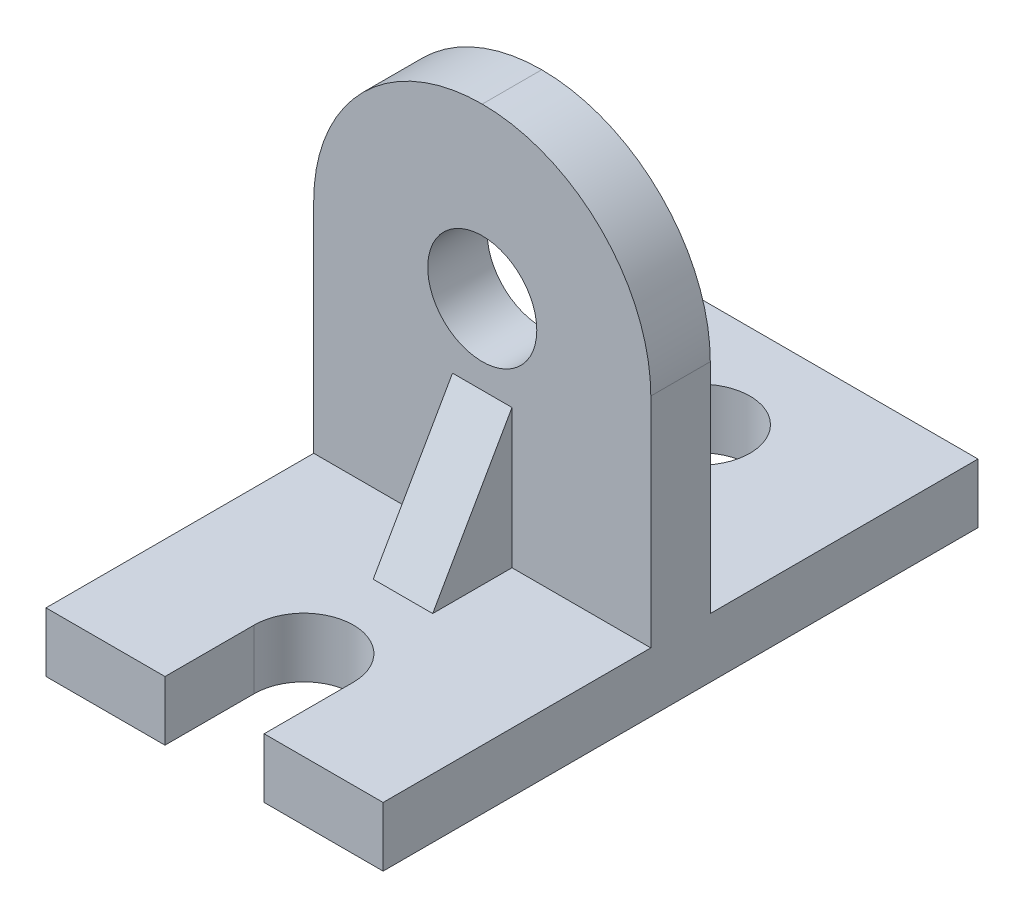
ISO-10303-21;
HEADER;
FILE_DESCRIPTION(('STEP AP214'),'2;1');
FILE_NAME('part.step','',(''),(''),'','','');
FILE_SCHEMA(('AUTOMOTIVE_DESIGN { 1 0 10303 214 1 1 1 1 }'));
ENDSEC;
DATA;
#1=APPLICATION_CONTEXT('core data for automotive mechanical design processes');
#2=APPLICATION_PROTOCOL_DEFINITION('international standard','automotive_design',2000,#1);
#3=PRODUCT_CONTEXT('',#1,'mechanical');
#4=PRODUCT('Part','Part','',(#3));
#5=PRODUCT_RELATED_PRODUCT_CATEGORY('part','',(#4));
#6=PRODUCT_DEFINITION_FORMATION('','',#4);
#7=PRODUCT_DEFINITION_CONTEXT('part definition',#1,'design');
#8=PRODUCT_DEFINITION('design','',#6,#7);
#9=PRODUCT_DEFINITION_SHAPE('','',#8);
#10=(LENGTH_UNIT() NAMED_UNIT(*) SI_UNIT(.MILLI.,.METRE.));
#11=(NAMED_UNIT(*) PLANE_ANGLE_UNIT() SI_UNIT($,.RADIAN.));
#12=(NAMED_UNIT(*) SI_UNIT($,.STERADIAN.) SOLID_ANGLE_UNIT());
#13=UNCERTAINTY_MEASURE_WITH_UNIT(LENGTH_MEASURE(1.E-05),#10,'distance_accuracy_value','');
#14=(GEOMETRIC_REPRESENTATION_CONTEXT(3) GLOBAL_UNCERTAINTY_ASSIGNED_CONTEXT((#13)) GLOBAL_UNIT_ASSIGNED_CONTEXT((#10,
#11,#12)) REPRESENTATION_CONTEXT('',''));
#15=CARTESIAN_POINT('',(0.,0.,0.));
#16=DIRECTION('',(0.,0.,1.));
#17=DIRECTION('',(1.,0.,0.));
#18=AXIS2_PLACEMENT_3D('',#15,#16,#17);
#19=CARTESIAN_POINT('',(-17.,0.,30.));
#20=DIRECTION('',(0.,0.,-1.));
#21=DIRECTION('',(-1.,0.,0.));
#22=AXIS2_PLACEMENT_3D('',#19,#20,#21);
#23=PLANE('',#22);
#24=DIRECTION('',(1.,0.,0.));
#25=VECTOR('',#24,1.);
#26=CARTESIAN_POINT('',(-17.,-19.5,30.));
#27=LINE('',#26,#25);
#28=CARTESIAN_POINT('',(5.,-19.5,30.));
#29=VERTEX_POINT('',#28);
#30=CARTESIAN_POINT('',(17.,-19.5,30.));
#31=VERTEX_POINT('',#30);
#32=EDGE_CURVE('E309',#29,#31,#27,.T.);
#33=ORIENTED_EDGE('',*,*,#32,.F.);
#34=DIRECTION('',(0.,1.,0.));
#35=VECTOR('',#34,1.);
#36=CARTESIAN_POINT('',(5.,-25.5,30.));
#37=LINE('',#36,#35);
#38=CARTESIAN_POINT('',(5.,-25.5,30.));
#39=VERTEX_POINT('',#38);
#40=EDGE_CURVE('E202',#39,#29,#37,.T.);
#41=ORIENTED_EDGE('',*,*,#40,.F.);
#42=DIRECTION('',(1.,0.,0.));
#43=VECTOR('',#42,1.);
#44=CARTESIAN_POINT('',(-17.,-25.5,30.));
#45=LINE('',#44,#43);
#46=CARTESIAN_POINT('',(17.,-25.5,30.));
#47=VERTEX_POINT('',#46);
#48=EDGE_CURVE('E194',#39,#47,#45,.T.);
#49=ORIENTED_EDGE('',*,*,#48,.T.);
#50=DIRECTION('',(0.,1.,0.));
#51=VECTOR('',#50,1.);
#52=CARTESIAN_POINT('',(17.,0.,30.));
#53=LINE('',#52,#51);
#54=EDGE_CURVE('E264',#47,#31,#53,.T.);
#55=ORIENTED_EDGE('',*,*,#54,.T.);
#56=EDGE_LOOP('',(#33,#41,#49,#55));
#57=FACE_BOUND('',#56,.T.);
#58=ADVANCED_FACE('F37',(#57),#23,.F.);
#59=CARTESIAN_POINT('',(-17.,0.,3.));
#60=DIRECTION('',(0.,0.,-1.));
#61=DIRECTION('',(-1.,0.,0.));
#62=AXIS2_PLACEMENT_3D('',#59,#60,#61);
#63=PLANE('',#62);
#64=CARTESIAN_POINT('',(0.,2.5,3.));
#65=DIRECTION('',(0.,0.,1.));
#66=DIRECTION('',(1.,0.,0.));
#67=AXIS2_PLACEMENT_3D('',#64,#65,#66);
#68=CIRCLE('',#67,5.5);
#69=CARTESIAN_POINT('',(5.5,2.5,3.));
#70=VERTEX_POINT('',#69);
#71=EDGE_CURVE('E252',#70,#70,#68,.T.);
#72=ORIENTED_EDGE('',*,*,#71,.F.);
#73=EDGE_LOOP('',(#72));
#74=FACE_BOUND('',#73,.T.);
#75=DIRECTION('',(0.,1.,0.));
#76=VECTOR('',#75,1.);
#77=CARTESIAN_POINT('',(-3.,0.,3.));
#78=LINE('',#77,#76);
#79=CARTESIAN_POINT('',(-3.,-19.5,3.));
#80=VERTEX_POINT('',#79);
#81=CARTESIAN_POINT('',(-3.,-5.5,3.));
#82=VERTEX_POINT('',#81);
#83=EDGE_CURVE('E245',#80,#82,#78,.T.);
#84=ORIENTED_EDGE('',*,*,#83,.T.);
#85=DIRECTION('',(1.,0.,0.));
#86=VECTOR('',#85,1.);
#87=CARTESIAN_POINT('',(-3.,-5.5,3.));
#88=LINE('',#87,#86);
#89=CARTESIAN_POINT('',(3.,-5.5,3.));
#90=VERTEX_POINT('',#89);
#91=EDGE_CURVE('E249',#82,#90,#88,.T.);
#92=ORIENTED_EDGE('',*,*,#91,.T.);
#93=DIRECTION('',(0.,1.,0.));
#94=VECTOR('',#93,1.);
#95=CARTESIAN_POINT('',(3.,0.,3.));
#96=LINE('',#95,#94);
#97=CARTESIAN_POINT('',(3.,-19.5,3.));
#98=VERTEX_POINT('',#97);
#99=EDGE_CURVE('E238',#98,#90,#96,.T.);
#100=ORIENTED_EDGE('',*,*,#99,.F.);
#101=DIRECTION('',(1.,0.,0.));
#102=VECTOR('',#101,1.);
#103=CARTESIAN_POINT('',(-17.,-19.5,3.));
#104=LINE('',#103,#102);
#105=CARTESIAN_POINT('',(17.,-19.5,3.));
#106=VERTEX_POINT('',#105);
#107=EDGE_CURVE('E294',#98,#106,#104,.T.);
#108=ORIENTED_EDGE('',*,*,#107,.T.);
#109=DIRECTION('',(0.,1.,0.));
#110=VECTOR('',#109,1.);
#111=CARTESIAN_POINT('',(17.,0.,3.));
#112=LINE('',#111,#110);
#113=CARTESIAN_POINT('',(17.,2.5,3.));
#114=VERTEX_POINT('',#113);
#115=EDGE_CURVE('E257',#106,#114,#112,.T.);
#116=ORIENTED_EDGE('',*,*,#115,.T.);
#117=CARTESIAN_POINT('',(0.,2.5,3.));
#118=DIRECTION('',(0.,0.,-1.));
#119=DIRECTION('',(-1.,0.,0.));
#120=AXIS2_PLACEMENT_3D('',#117,#118,#119);
#121=CIRCLE('',#120,17.);
#122=CARTESIAN_POINT('',(0.,19.5,3.));
#123=VERTEX_POINT('',#122);
#124=EDGE_CURVE('E319',#114,#123,#121,.F.);
#125=ORIENTED_EDGE('',*,*,#124,.T.);
#126=CARTESIAN_POINT('',(0.,2.5,3.));
#127=DIRECTION('',(0.,0.,-1.));
#128=DIRECTION('',(-1.,0.,0.));
#129=AXIS2_PLACEMENT_3D('',#126,#127,#128);
#130=CIRCLE('',#129,17.);
#131=CARTESIAN_POINT('',(-17.,2.5,3.));
#132=VERTEX_POINT('',#131);
#133=EDGE_CURVE('E46',#123,#132,#130,.F.);
#134=ORIENTED_EDGE('',*,*,#133,.T.);
#135=DIRECTION('',(0.,1.,0.));
#136=VECTOR('',#135,1.);
#137=CARTESIAN_POINT('',(-17.,0.,3.));
#138=LINE('',#137,#136);
#139=CARTESIAN_POINT('',(-17.,-19.5,3.));
#140=VERTEX_POINT('',#139);
#141=EDGE_CURVE('E277',#140,#132,#138,.T.);
#142=ORIENTED_EDGE('',*,*,#141,.F.);
#143=EDGE_CURVE('E310',#140,#80,#104,.T.);
#144=ORIENTED_EDGE('',*,*,#143,.T.);
#145=EDGE_LOOP('',(#84,#92,#100,#108,#116,#125,#134,#142,#144));
#146=FACE_BOUND('',#145,.T.);
#147=ADVANCED_FACE('F343',(#74,#146),#63,.F.);
#148=CARTESIAN_POINT('',(-17.,-19.5,0.));
#149=DIRECTION('',(0.,-1.,0.));
#150=DIRECTION('',(0.,0.,-1.));
#151=AXIS2_PLACEMENT_3D('',#148,#149,#150);
#152=PLANE('',#151);
#153=CARTESIAN_POINT('',(0.,-19.5,21.));
#154=DIRECTION('',(0.,1.,0.));
#155=DIRECTION('',(0.,0.,1.));
#156=AXIS2_PLACEMENT_3D('',#153,#154,#155);
#157=CIRCLE('',#156,5.);
#158=CARTESIAN_POINT('',(5.,-19.5,21.));
#159=VERTEX_POINT('',#158);
#160=CARTESIAN_POINT('',(-5.,-19.5,21.));
#161=VERTEX_POINT('',#160);
#162=EDGE_CURVE('E196',#159,#161,#157,.T.);
#163=ORIENTED_EDGE('',*,*,#162,.F.);
#164=DIRECTION('',(0.,0.,-1.));
#165=VECTOR('',#164,1.);
#166=CARTESIAN_POINT('',(5.,-19.5,0.));
#167=LINE('',#166,#165);
#168=EDGE_CURVE('E176',#29,#159,#167,.T.);
#169=ORIENTED_EDGE('',*,*,#168,.F.);
#170=ORIENTED_EDGE('',*,*,#32,.T.);
#171=DIRECTION('',(0.,0.,-1.));
#172=VECTOR('',#171,1.);
#173=CARTESIAN_POINT('',(17.,-19.5,0.));
#174=LINE('',#173,#172);
#175=EDGE_CURVE('E260',#31,#106,#174,.T.);
#176=ORIENTED_EDGE('',*,*,#175,.T.);
#177=ORIENTED_EDGE('',*,*,#107,.F.);
#178=DIRECTION('',(0.,0.,-1.));
#179=VECTOR('',#178,1.);
#180=CARTESIAN_POINT('',(3.,-19.5,0.));
#181=LINE('',#180,#179);
#182=CARTESIAN_POINT('',(3.,-19.5,11.));
#183=VERTEX_POINT('',#182);
#184=EDGE_CURVE('E236',#183,#98,#181,.T.);
#185=ORIENTED_EDGE('',*,*,#184,.F.);
#186=DIRECTION('',(1.,0.,0.));
#187=VECTOR('',#186,1.);
#188=CARTESIAN_POINT('',(-3.,-19.5,11.));
#189=LINE('',#188,#187);
#190=CARTESIAN_POINT('',(-3.,-19.5,11.));
#191=VERTEX_POINT('',#190);
#192=EDGE_CURVE('E248',#191,#183,#189,.T.);
#193=ORIENTED_EDGE('',*,*,#192,.F.);
#194=DIRECTION('',(0.,0.,-1.));
#195=VECTOR('',#194,1.);
#196=CARTESIAN_POINT('',(-3.,-19.5,0.));
#197=LINE('',#196,#195);
#198=EDGE_CURVE('E242',#191,#80,#197,.T.);
#199=ORIENTED_EDGE('',*,*,#198,.T.);
#200=ORIENTED_EDGE('',*,*,#143,.F.);
#201=DIRECTION('',(0.,0.,-1.));
#202=VECTOR('',#201,1.);
#203=CARTESIAN_POINT('',(-17.,-19.5,0.));
#204=LINE('',#203,#202);
#205=CARTESIAN_POINT('',(-17.,-19.5,30.));
#206=VERTEX_POINT('',#205);
#207=EDGE_CURVE('E280',#206,#140,#204,.T.);
#208=ORIENTED_EDGE('',*,*,#207,.F.);
#209=CARTESIAN_POINT('',(-5.,-19.5,30.));
#210=VERTEX_POINT('',#209);
#211=EDGE_CURVE('E306',#206,#210,#27,.T.);
#212=ORIENTED_EDGE('',*,*,#211,.T.);
#213=DIRECTION('',(0.,0.,1.));
#214=VECTOR('',#213,1.);
#215=CARTESIAN_POINT('',(-5.,-19.5,0.));
#216=LINE('',#215,#214);
#217=EDGE_CURVE('E54',#161,#210,#216,.T.);
#218=ORIENTED_EDGE('',*,*,#217,.F.);
#219=EDGE_LOOP('',(#163,#169,#170,#176,#177,#185,#193,#199,#200,#208,#212,#218));
#220=FACE_BOUND('',#219,.T.);
#221=ADVANCED_FACE('F334',(#220),#152,.F.);
#222=CARTESIAN_POINT('',(-17.,0.,-3.));
#223=DIRECTION('',(0.,0.,-1.));
#224=DIRECTION('',(-1.,0.,0.));
#225=AXIS2_PLACEMENT_3D('',#222,#223,#224);
#226=PLANE('',#225);
#227=DIRECTION('',(0.,1.,0.));
#228=VECTOR('',#227,1.);
#229=CARTESIAN_POINT('',(3.,0.,-3.));
#230=LINE('',#229,#228);
#231=CARTESIAN_POINT('',(3.,-19.5,-3.));
#232=VERTEX_POINT('',#231);
#233=CARTESIAN_POINT('',(3.,-5.5,-3.));
#234=VERTEX_POINT('',#233);
#235=EDGE_CURVE('E62',#232,#234,#230,.T.);
#236=ORIENTED_EDGE('',*,*,#235,.T.);
#237=DIRECTION('',(-1.,0.,0.));
#238=VECTOR('',#237,1.);
#239=CARTESIAN_POINT('',(3.,-5.5,-3.));
#240=LINE('',#239,#238);
#241=CARTESIAN_POINT('',(-3.,-5.5,-3.));
#242=VERTEX_POINT('',#241);
#243=EDGE_CURVE('E231',#234,#242,#240,.T.);
#244=ORIENTED_EDGE('',*,*,#243,.T.);
#245=DIRECTION('',(0.,1.,0.));
#246=VECTOR('',#245,1.);
#247=CARTESIAN_POINT('',(-3.,0.,-3.));
#248=LINE('',#247,#246);
#249=CARTESIAN_POINT('',(-3.,-19.5,-3.));
#250=VERTEX_POINT('',#249);
#251=EDGE_CURVE('E216',#250,#242,#248,.T.);
#252=ORIENTED_EDGE('',*,*,#251,.F.);
#253=DIRECTION('',(1.,0.,0.));
#254=VECTOR('',#253,1.);
#255=CARTESIAN_POINT('',(-17.,-19.5,-3.));
#256=LINE('',#255,#254);
#257=CARTESIAN_POINT('',(-17.,-19.5,-3.));
#258=VERTEX_POINT('',#257);
#259=EDGE_CURVE('E295',#258,#250,#256,.T.);
#260=ORIENTED_EDGE('',*,*,#259,.F.);
#261=DIRECTION('',(0.,1.,0.));
#262=VECTOR('',#261,1.);
#263=CARTESIAN_POINT('',(-17.,0.,-3.));
#264=LINE('',#263,#262);
#265=CARTESIAN_POINT('',(-17.,2.5,-3.));
#266=VERTEX_POINT('',#265);
#267=EDGE_CURVE('E291',#258,#266,#264,.T.);
#268=ORIENTED_EDGE('',*,*,#267,.T.);
#269=CARTESIAN_POINT('',(0.,2.5,-3.));
#270=DIRECTION('',(0.,0.,-1.));
#271=DIRECTION('',(-1.,0.,0.));
#272=AXIS2_PLACEMENT_3D('',#269,#270,#271);
#273=CIRCLE('',#272,17.);
#274=CARTESIAN_POINT('',(0.,19.5,-3.));
#275=VERTEX_POINT('',#274);
#276=EDGE_CURVE('E317',#266,#275,#273,.T.);
#277=ORIENTED_EDGE('',*,*,#276,.T.);
#278=CARTESIAN_POINT('',(0.,2.5,-3.));
#279=DIRECTION('',(0.,0.,-1.));
#280=DIRECTION('',(-1.,0.,0.));
#281=AXIS2_PLACEMENT_3D('',#278,#279,#280);
#282=CIRCLE('',#281,17.);
#283=CARTESIAN_POINT('',(17.,2.5,-3.));
#284=VERTEX_POINT('',#283);
#285=EDGE_CURVE('E315',#275,#284,#282,.T.);
#286=ORIENTED_EDGE('',*,*,#285,.T.);
#287=DIRECTION('',(0.,1.,0.));
#288=VECTOR('',#287,1.);
#289=CARTESIAN_POINT('',(17.,0.,-3.));
#290=LINE('',#289,#288);
#291=CARTESIAN_POINT('',(17.,-19.5,-3.));
#292=VERTEX_POINT('',#291);
#293=EDGE_CURVE('E274',#292,#284,#290,.T.);
#294=ORIENTED_EDGE('',*,*,#293,.F.);
#295=EDGE_CURVE('E298',#232,#292,#256,.T.);
#296=ORIENTED_EDGE('',*,*,#295,.F.);
#297=EDGE_LOOP('',(#236,#244,#252,#260,#268,#277,#286,#294,#296));
#298=FACE_BOUND('',#297,.T.);
#299=CARTESIAN_POINT('',(0.,2.5,-3.));
#300=DIRECTION('',(0.,0.,-1.));
#301=DIRECTION('',(-1.,0.,0.));
#302=AXIS2_PLACEMENT_3D('',#299,#300,#301);
#303=CIRCLE('',#302,5.5);
#304=CARTESIAN_POINT('',(-5.5,2.5,-3.));
#305=VERTEX_POINT('',#304);
#306=EDGE_CURVE('E41',#305,#305,#303,.T.);
#307=ORIENTED_EDGE('',*,*,#306,.F.);
#308=EDGE_LOOP('',(#307));
#309=FACE_BOUND('',#308,.T.);
#310=ADVANCED_FACE('F331',(#298,#309),#226,.T.);
#311=CARTESIAN_POINT('',(0.,-19.5,-19.));
#312=DIRECTION('',(0.,1.,0.));
#313=DIRECTION('',(0.,0.,1.));
#314=AXIS2_PLACEMENT_3D('',#311,#312,#313);
#315=CIRCLE('',#314,5.);
#316=CARTESIAN_POINT('',(0.,-19.5,-14.));
#317=VERTEX_POINT('',#316);
#318=EDGE_CURVE('E204',#317,#317,#315,.T.);
#319=ORIENTED_EDGE('',*,*,#318,.F.);
#320=EDGE_LOOP('',(#319));
#321=FACE_BOUND('',#320,.T.);
#322=DIRECTION('',(-1.,0.,0.));
#323=VECTOR('',#322,1.);
#324=CARTESIAN_POINT('',(3.,-19.5,-11.));
#325=LINE('',#324,#323);
#326=CARTESIAN_POINT('',(3.,-19.5,-11.));
#327=VERTEX_POINT('',#326);
#328=CARTESIAN_POINT('',(-3.,-19.5,-11.));
#329=VERTEX_POINT('',#328);
#330=EDGE_CURVE('E228',#327,#329,#325,.T.);
#331=ORIENTED_EDGE('',*,*,#330,.F.);
#332=DIRECTION('',(0.,0.,-1.));
#333=VECTOR('',#332,1.);
#334=CARTESIAN_POINT('',(3.,-19.5,0.));
#335=LINE('',#334,#333);
#336=EDGE_CURVE('E225',#232,#327,#335,.T.);
#337=ORIENTED_EDGE('',*,*,#336,.F.);
#338=ORIENTED_EDGE('',*,*,#295,.T.);
#339=CARTESIAN_POINT('',(17.,-19.5,-30.));
#340=VERTEX_POINT('',#339);
#341=EDGE_CURVE('E265',#292,#340,#174,.T.);
#342=ORIENTED_EDGE('',*,*,#341,.T.);
#343=DIRECTION('',(1.,0.,0.));
#344=VECTOR('',#343,1.);
#345=CARTESIAN_POINT('',(-17.,-19.5,-30.));
#346=LINE('',#345,#344);
#347=CARTESIAN_POINT('',(-17.,-19.5,-30.));
#348=VERTEX_POINT('',#347);
#349=EDGE_CURVE('E299',#348,#340,#346,.T.);
#350=ORIENTED_EDGE('',*,*,#349,.F.);
#351=EDGE_CURVE('E283',#258,#348,#204,.T.);
#352=ORIENTED_EDGE('',*,*,#351,.F.);
#353=ORIENTED_EDGE('',*,*,#259,.T.);
#354=DIRECTION('',(0.,0.,-1.));
#355=VECTOR('',#354,1.);
#356=CARTESIAN_POINT('',(-3.,-19.5,0.));
#357=LINE('',#356,#355);
#358=EDGE_CURVE('E219',#250,#329,#357,.T.);
#359=ORIENTED_EDGE('',*,*,#358,.T.);
#360=EDGE_LOOP('',(#331,#337,#338,#342,#350,#352,#353,#359));
#361=FACE_BOUND('',#360,.T.);
#362=ADVANCED_FACE('F333',(#321,#361),#152,.F.);
#363=CARTESIAN_POINT('',(-17.,0.,-30.));
#364=DIRECTION('',(0.,0.,-1.));
#365=DIRECTION('',(-1.,0.,0.));
#366=AXIS2_PLACEMENT_3D('',#363,#364,#365);
#367=PLANE('',#366);
#368=ORIENTED_EDGE('',*,*,#349,.T.);
#369=DIRECTION('',(0.,1.,0.));
#370=VECTOR('',#369,1.);
#371=CARTESIAN_POINT('',(17.,0.,-30.));
#372=LINE('',#371,#370);
#373=CARTESIAN_POINT('',(17.,-25.5,-30.));
#374=VERTEX_POINT('',#373);
#375=EDGE_CURVE('E271',#374,#340,#372,.T.);
#376=ORIENTED_EDGE('',*,*,#375,.F.);
#377=DIRECTION('',(1.,0.,0.));
#378=VECTOR('',#377,1.);
#379=CARTESIAN_POINT('',(-17.,-25.5,-30.));
#380=LINE('',#379,#378);
#381=CARTESIAN_POINT('',(-17.,-25.5,-30.));
#382=VERTEX_POINT('',#381);
#383=EDGE_CURVE('E301',#382,#374,#380,.T.);
#384=ORIENTED_EDGE('',*,*,#383,.F.);
#385=DIRECTION('',(0.,1.,0.));
#386=VECTOR('',#385,1.);
#387=CARTESIAN_POINT('',(-17.,0.,-30.));
#388=LINE('',#387,#386);
#389=EDGE_CURVE('E288',#382,#348,#388,.T.);
#390=ORIENTED_EDGE('',*,*,#389,.T.);
#391=EDGE_LOOP('',(#368,#376,#384,#390));
#392=FACE_BOUND('',#391,.T.);
#393=ADVANCED_FACE('F340',(#392),#367,.T.);
#394=CARTESIAN_POINT('',(-17.,-25.5,0.));
#395=DIRECTION('',(0.,-1.,0.));
#396=DIRECTION('',(0.,0.,-1.));
#397=AXIS2_PLACEMENT_3D('',#394,#395,#396);
#398=PLANE('',#397);
#399=DIRECTION('',(0.,0.,-1.));
#400=VECTOR('',#399,1.);
#401=CARTESIAN_POINT('',(5.,-25.5,0.));
#402=LINE('',#401,#400);
#403=CARTESIAN_POINT('',(5.,-25.5,21.));
#404=VERTEX_POINT('',#403);
#405=EDGE_CURVE('E173',#39,#404,#402,.T.);
#406=ORIENTED_EDGE('',*,*,#405,.T.);
#407=CARTESIAN_POINT('',(0.,-25.5,21.));
#408=DIRECTION('',(0.,1.,0.));
#409=DIRECTION('',(0.,0.,1.));
#410=AXIS2_PLACEMENT_3D('',#407,#408,#409);
#411=CIRCLE('',#410,5.);
#412=CARTESIAN_POINT('',(-5.,-25.5,21.));
#413=VERTEX_POINT('',#412);
#414=EDGE_CURVE('E184',#404,#413,#411,.T.);
#415=ORIENTED_EDGE('',*,*,#414,.T.);
#416=DIRECTION('',(0.,0.,1.));
#417=VECTOR('',#416,1.);
#418=CARTESIAN_POINT('',(-5.,-25.5,0.));
#419=LINE('',#418,#417);
#420=CARTESIAN_POINT('',(-5.,-25.5,30.));
#421=VERTEX_POINT('',#420);
#422=EDGE_CURVE('E181',#413,#421,#419,.T.);
#423=ORIENTED_EDGE('',*,*,#422,.T.);
#424=CARTESIAN_POINT('',(-17.,-25.5,30.));
#425=VERTEX_POINT('',#424);
#426=EDGE_CURVE('E303',#425,#421,#45,.T.);
#427=ORIENTED_EDGE('',*,*,#426,.F.);
#428=DIRECTION('',(0.,0.,-1.));
#429=VECTOR('',#428,1.);
#430=CARTESIAN_POINT('',(-17.,-25.5,0.));
#431=LINE('',#430,#429);
#432=EDGE_CURVE('E285',#425,#382,#431,.T.);
#433=ORIENTED_EDGE('',*,*,#432,.T.);
#434=ORIENTED_EDGE('',*,*,#383,.T.);
#435=DIRECTION('',(0.,0.,-1.));
#436=VECTOR('',#435,1.);
#437=CARTESIAN_POINT('',(17.,-25.5,0.));
#438=LINE('',#437,#436);
#439=EDGE_CURVE('E268',#47,#374,#438,.T.);
#440=ORIENTED_EDGE('',*,*,#439,.F.);
#441=ORIENTED_EDGE('',*,*,#48,.F.);
#442=EDGE_LOOP('',(#406,#415,#423,#427,#433,#434,#440,#441));
#443=FACE_BOUND('',#442,.T.);
#444=CARTESIAN_POINT('',(0.,-25.5,-19.));
#445=DIRECTION('',(0.,1.,0.));
#446=DIRECTION('',(0.,0.,1.));
#447=AXIS2_PLACEMENT_3D('',#444,#445,#446);
#448=CIRCLE('',#447,5.);
#449=CARTESIAN_POINT('',(0.,-25.5,-14.));
#450=VERTEX_POINT('',#449);
#451=EDGE_CURVE('E208',#450,#450,#448,.T.);
#452=ORIENTED_EDGE('',*,*,#451,.T.);
#453=EDGE_LOOP('',(#452));
#454=FACE_BOUND('',#453,.T.);
#455=ADVANCED_FACE('F191',(#443,#454),#398,.T.);
#456=ORIENTED_EDGE('',*,*,#426,.T.);
#457=DIRECTION('',(0.,1.,0.));
#458=VECTOR('',#457,1.);
#459=CARTESIAN_POINT('',(-5.,-25.5,30.));
#460=LINE('',#459,#458);
#461=EDGE_CURVE('E205',#421,#210,#460,.T.);
#462=ORIENTED_EDGE('',*,*,#461,.T.);
#463=ORIENTED_EDGE('',*,*,#211,.F.);
#464=DIRECTION('',(0.,1.,0.));
#465=VECTOR('',#464,1.);
#466=CARTESIAN_POINT('',(-17.,0.,30.));
#467=LINE('',#466,#465);
#468=EDGE_CURVE('E282',#425,#206,#467,.T.);
#469=ORIENTED_EDGE('',*,*,#468,.F.);
#470=EDGE_LOOP('',(#456,#462,#463,#469));
#471=FACE_BOUND('',#470,.T.);
#472=ADVANCED_FACE('F349',(#471),#23,.F.);
#473=CARTESIAN_POINT('',(-17.,0.,0.));
#474=DIRECTION('',(1.,0.,0.));
#475=DIRECTION('',(0.,0.,-1.));
#476=AXIS2_PLACEMENT_3D('',#473,#474,#475);
#477=PLANE('',#476);
#478=ORIENTED_EDGE('',*,*,#141,.T.);
#479=DIRECTION('',(0.,0.,-1.));
#480=VECTOR('',#479,1.);
#481=CARTESIAN_POINT('',(-17.,2.5,0.));
#482=LINE('',#481,#480);
#483=EDGE_CURVE('E297',#132,#266,#482,.T.);
#484=ORIENTED_EDGE('',*,*,#483,.T.);
#485=ORIENTED_EDGE('',*,*,#267,.F.);
#486=ORIENTED_EDGE('',*,*,#351,.T.);
#487=ORIENTED_EDGE('',*,*,#389,.F.);
#488=ORIENTED_EDGE('',*,*,#432,.F.);
#489=ORIENTED_EDGE('',*,*,#468,.T.);
#490=ORIENTED_EDGE('',*,*,#207,.T.);
#491=EDGE_LOOP('',(#478,#484,#485,#486,#487,#488,#489,#490));
#492=FACE_BOUND('',#491,.T.);
#493=ADVANCED_FACE('F358',(#492),#477,.F.);
#494=CARTESIAN_POINT('',(17.,0.,0.));
#495=DIRECTION('',(1.,0.,0.));
#496=DIRECTION('',(0.,0.,-1.));
#497=AXIS2_PLACEMENT_3D('',#494,#495,#496);
#498=PLANE('',#497);
#499=ORIENTED_EDGE('',*,*,#293,.T.);
#500=DIRECTION('',(0.,0.,-1.));
#501=VECTOR('',#500,1.);
#502=CARTESIAN_POINT('',(17.,2.5,3.));
#503=LINE('',#502,#501);
#504=EDGE_CURVE('E11',#284,#114,#503,.F.);
#505=ORIENTED_EDGE('',*,*,#504,.T.);
#506=ORIENTED_EDGE('',*,*,#115,.F.);
#507=ORIENTED_EDGE('',*,*,#175,.F.);
#508=ORIENTED_EDGE('',*,*,#54,.F.);
#509=ORIENTED_EDGE('',*,*,#439,.T.);
#510=ORIENTED_EDGE('',*,*,#375,.T.);
#511=ORIENTED_EDGE('',*,*,#341,.F.);
#512=EDGE_LOOP('',(#499,#505,#506,#507,#508,#509,#510,#511));
#513=FACE_BOUND('',#512,.T.);
#514=ADVANCED_FACE('F364',(#513),#498,.T.);
#515=CARTESIAN_POINT('',(0.,2.5,0.));
#516=DIRECTION('',(0.,0.,1.));
#517=DIRECTION('',(1.,0.,0.));
#518=AXIS2_PLACEMENT_3D('',#515,#516,#517);
#519=CYLINDRICAL_SURFACE('',#518,17.);
#520=DIRECTION('',(0.,0.,-1.));
#521=VECTOR('',#520,1.);
#522=CARTESIAN_POINT('',(0.,19.5,-3.));
#523=LINE('',#522,#521);
#524=EDGE_CURVE('E261',#123,#275,#523,.T.);
#525=ORIENTED_EDGE('',*,*,#524,.F.);
#526=ORIENTED_EDGE('',*,*,#124,.F.);
#527=ORIENTED_EDGE('',*,*,#504,.F.);
#528=ORIENTED_EDGE('',*,*,#285,.F.);
#529=EDGE_LOOP('',(#525,#526,#527,#528));
#530=FACE_BOUND('',#529,.T.);
#531=ADVANCED_FACE('F39',(#530),#519,.T.);
#532=CARTESIAN_POINT('',(0.,2.5,0.));
#533=DIRECTION('',(0.,0.,-1.));
#534=DIRECTION('',(-1.,0.,0.));
#535=AXIS2_PLACEMENT_3D('',#532,#533,#534);
#536=CYLINDRICAL_SURFACE('',#535,17.);
#537=ORIENTED_EDGE('',*,*,#133,.F.);
#538=ORIENTED_EDGE('',*,*,#524,.T.);
#539=ORIENTED_EDGE('',*,*,#276,.F.);
#540=ORIENTED_EDGE('',*,*,#483,.F.);
#541=EDGE_LOOP('',(#537,#538,#539,#540));
#542=FACE_BOUND('',#541,.T.);
#543=ADVANCED_FACE('F396',(#542),#536,.T.);
#544=CARTESIAN_POINT('',(0.,2.5,-30.));
#545=DIRECTION('',(0.,0.,1.));
#546=DIRECTION('',(1.,0.,0.));
#547=AXIS2_PLACEMENT_3D('',#544,#545,#546);
#548=CYLINDRICAL_SURFACE('',#547,5.5);
#549=ORIENTED_EDGE('',*,*,#306,.T.);
#550=EDGE_LOOP('',(#549));
#551=FACE_BOUND('',#550,.T.);
#552=ORIENTED_EDGE('',*,*,#71,.T.);
#553=EDGE_LOOP('',(#552));
#554=FACE_BOUND('',#553,.T.);
#555=ADVANCED_FACE('F328',(#551,#554),#548,.F.);
#556=CARTESIAN_POINT('',(-3.,-0.0615384615384628,-0.10769230769231));
#557=DIRECTION('',(0.,-0.496138938356834,-0.868243142124459));
#558=DIRECTION('',(0.,0.868243142124459,-0.496138938356834));
#559=AXIS2_PLACEMENT_3D('',#556,#557,#558);
#560=PLANE('',#559);
#561=DIRECTION('',(0.,0.868243142124459,-0.496138938356834));
#562=VECTOR('',#561,1.);
#563=CARTESIAN_POINT('',(3.,-0.0615384615384628,-0.10769230769231));
#564=LINE('',#563,#562);
#565=EDGE_CURVE('E233',#183,#90,#564,.T.);
#566=ORIENTED_EDGE('',*,*,#565,.T.);
#567=ORIENTED_EDGE('',*,*,#91,.F.);
#568=DIRECTION('',(0.,0.868243142124459,-0.496138938356834));
#569=VECTOR('',#568,1.);
#570=CARTESIAN_POINT('',(-3.,-0.0615384615384628,-0.10769230769231));
#571=LINE('',#570,#569);
#572=EDGE_CURVE('E240',#191,#82,#571,.T.);
#573=ORIENTED_EDGE('',*,*,#572,.F.);
#574=ORIENTED_EDGE('',*,*,#192,.T.);
#575=EDGE_LOOP('',(#566,#567,#573,#574));
#576=FACE_BOUND('',#575,.T.);
#577=ADVANCED_FACE('F429',(#576),#560,.F.);
#578=CARTESIAN_POINT('',(-3.,0.,0.));
#579=DIRECTION('',(1.,0.,0.));
#580=DIRECTION('',(0.,0.,-1.));
#581=AXIS2_PLACEMENT_3D('',#578,#579,#580);
#582=PLANE('',#581);
#583=ORIENTED_EDGE('',*,*,#572,.T.);
#584=ORIENTED_EDGE('',*,*,#83,.F.);
#585=ORIENTED_EDGE('',*,*,#198,.F.);
#586=EDGE_LOOP('',(#583,#584,#585));
#587=FACE_BOUND('',#586,.T.);
#588=ADVANCED_FACE('F425',(#587),#582,.F.);
#589=CARTESIAN_POINT('',(3.,0.,0.));
#590=DIRECTION('',(1.,0.,0.));
#591=DIRECTION('',(0.,0.,-1.));
#592=AXIS2_PLACEMENT_3D('',#589,#590,#591);
#593=PLANE('',#592);
#594=ORIENTED_EDGE('',*,*,#565,.F.);
#595=ORIENTED_EDGE('',*,*,#184,.T.);
#596=ORIENTED_EDGE('',*,*,#99,.T.);
#597=EDGE_LOOP('',(#594,#595,#596));
#598=FACE_BOUND('',#597,.T.);
#599=ADVANCED_FACE('F422',(#598),#593,.T.);
#600=CARTESIAN_POINT('',(3.,-0.0615384615384606,0.107692307692306));
#601=DIRECTION('',(0.,0.496138938356834,-0.868243142124459));
#602=DIRECTION('',(0.,0.868243142124459,0.496138938356834));
#603=AXIS2_PLACEMENT_3D('',#600,#601,#602);
#604=PLANE('',#603);
#605=ORIENTED_EDGE('',*,*,#330,.T.);
#606=DIRECTION('',(0.,-0.868243142124459,-0.496138938356834));
#607=VECTOR('',#606,1.);
#608=CARTESIAN_POINT('',(-3.,-0.0615384615384606,0.107692307692306));
#609=LINE('',#608,#607);
#610=EDGE_CURVE('E211',#242,#329,#609,.T.);
#611=ORIENTED_EDGE('',*,*,#610,.F.);
#612=ORIENTED_EDGE('',*,*,#243,.F.);
#613=DIRECTION('',(0.,-0.868243142124459,-0.496138938356834));
#614=VECTOR('',#613,1.);
#615=CARTESIAN_POINT('',(3.,-0.0615384615384606,0.107692307692306));
#616=LINE('',#615,#614);
#617=EDGE_CURVE('E221',#234,#327,#616,.T.);
#618=ORIENTED_EDGE('',*,*,#617,.T.);
#619=EDGE_LOOP('',(#605,#611,#612,#618));
#620=FACE_BOUND('',#619,.T.);
#621=ADVANCED_FACE('F404',(#620),#604,.T.);
#622=CARTESIAN_POINT('',(3.,0.,0.));
#623=DIRECTION('',(1.,0.,0.));
#624=DIRECTION('',(0.,0.,-1.));
#625=AXIS2_PLACEMENT_3D('',#622,#623,#624);
#626=PLANE('',#625);
#627=ORIENTED_EDGE('',*,*,#617,.F.);
#628=ORIENTED_EDGE('',*,*,#235,.F.);
#629=ORIENTED_EDGE('',*,*,#336,.T.);
#630=EDGE_LOOP('',(#627,#628,#629));
#631=FACE_BOUND('',#630,.T.);
#632=ADVANCED_FACE('F402',(#631),#626,.T.);
#633=CARTESIAN_POINT('',(-3.,0.,0.));
#634=DIRECTION('',(1.,0.,0.));
#635=DIRECTION('',(0.,0.,-1.));
#636=AXIS2_PLACEMENT_3D('',#633,#634,#635);
#637=PLANE('',#636);
#638=ORIENTED_EDGE('',*,*,#610,.T.);
#639=ORIENTED_EDGE('',*,*,#358,.F.);
#640=ORIENTED_EDGE('',*,*,#251,.T.);
#641=EDGE_LOOP('',(#638,#639,#640));
#642=FACE_BOUND('',#641,.T.);
#643=ADVANCED_FACE('F407',(#642),#637,.F.);
#644=CARTESIAN_POINT('',(0.,-25.5,-19.));
#645=DIRECTION('',(0.,1.,0.));
#646=DIRECTION('',(0.,0.,1.));
#647=AXIS2_PLACEMENT_3D('',#644,#645,#646);
#648=CYLINDRICAL_SURFACE('',#647,5.);
#649=ORIENTED_EDGE('',*,*,#451,.F.);
#650=EDGE_LOOP('',(#649));
#651=FACE_BOUND('',#650,.T.);
#652=ORIENTED_EDGE('',*,*,#318,.T.);
#653=EDGE_LOOP('',(#652));
#654=FACE_BOUND('',#653,.T.);
#655=ADVANCED_FACE('F409',(#651,#654),#648,.F.);
#656=CARTESIAN_POINT('',(5.,-25.5,0.));
#657=DIRECTION('',(1.,0.,0.));
#658=DIRECTION('',(0.,0.,-1.));
#659=AXIS2_PLACEMENT_3D('',#656,#657,#658);
#660=PLANE('',#659);
#661=ORIENTED_EDGE('',*,*,#168,.T.);
#662=DIRECTION('',(0.,1.,0.));
#663=VECTOR('',#662,1.);
#664=CARTESIAN_POINT('',(5.,-25.5,21.));
#665=LINE('',#664,#663);
#666=EDGE_CURVE('E169',#404,#159,#665,.T.);
#667=ORIENTED_EDGE('',*,*,#666,.F.);
#668=ORIENTED_EDGE('',*,*,#405,.F.);
#669=ORIENTED_EDGE('',*,*,#40,.T.);
#670=EDGE_LOOP('',(#661,#667,#668,#669));
#671=FACE_BOUND('',#670,.T.);
#672=ADVANCED_FACE('F171',(#671),#660,.F.);
#673=CARTESIAN_POINT('',(-5.,-25.5,0.));
#674=DIRECTION('',(-1.,0.,0.));
#675=DIRECTION('',(0.,0.,1.));
#676=AXIS2_PLACEMENT_3D('',#673,#674,#675);
#677=PLANE('',#676);
#678=ORIENTED_EDGE('',*,*,#217,.T.);
#679=ORIENTED_EDGE('',*,*,#461,.F.);
#680=ORIENTED_EDGE('',*,*,#422,.F.);
#681=DIRECTION('',(0.,1.,0.));
#682=VECTOR('',#681,1.);
#683=CARTESIAN_POINT('',(-5.,-25.5,21.));
#684=LINE('',#683,#682);
#685=EDGE_CURVE('E180',#413,#161,#684,.T.);
#686=ORIENTED_EDGE('',*,*,#685,.T.);
#687=EDGE_LOOP('',(#678,#679,#680,#686));
#688=FACE_BOUND('',#687,.T.);
#689=ADVANCED_FACE('F369',(#688),#677,.F.);
#690=CARTESIAN_POINT('',(0.,-25.5,21.));
#691=DIRECTION('',(0.,1.,0.));
#692=DIRECTION('',(0.,0.,1.));
#693=AXIS2_PLACEMENT_3D('',#690,#691,#692);
#694=CYLINDRICAL_SURFACE('',#693,5.);
#695=ORIENTED_EDGE('',*,*,#162,.T.);
#696=ORIENTED_EDGE('',*,*,#685,.F.);
#697=ORIENTED_EDGE('',*,*,#414,.F.);
#698=ORIENTED_EDGE('',*,*,#666,.T.);
#699=EDGE_LOOP('',(#695,#696,#697,#698));
#700=FACE_BOUND('',#699,.T.);
#701=ADVANCED_FACE('F185',(#700),#694,.F.);
#702=CLOSED_SHELL('',(#58,#147,#221,#310,#362,#393,#455,#472,#493,#514,#531,#543,#555,#577,#588,
#599,#621,#632,#643,#655,#672,#689,#701));
#703=MANIFOLD_SOLID_BREP('B2',#702);
#704=ADVANCED_BREP_SHAPE_REPRESENTATION('',(#18,#703),#14);
#705=SHAPE_DEFINITION_REPRESENTATION(#9,#704);
ENDSEC;
END-ISO-10303-21;
